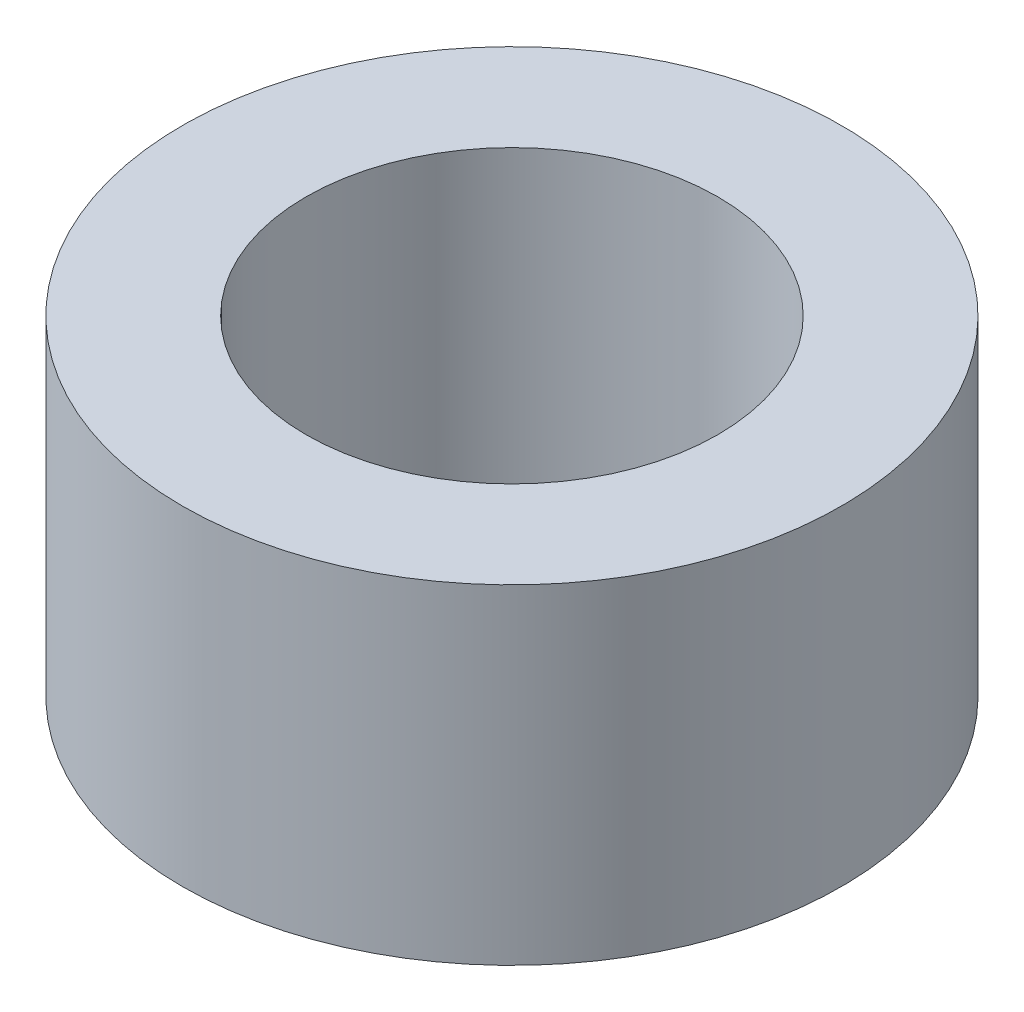
ISO-10303-21;
HEADER;
FILE_DESCRIPTION(('STEP AP214'),'2;1');
FILE_NAME('part.step','',(''),(''),'','','');
FILE_SCHEMA(('AUTOMOTIVE_DESIGN { 1 0 10303 214 1 1 1 1 }'));
ENDSEC;
DATA;
#1=APPLICATION_CONTEXT('core data for automotive mechanical design processes');
#2=APPLICATION_PROTOCOL_DEFINITION('international standard','automotive_design',2000,#1);
#3=PRODUCT_CONTEXT('',#1,'mechanical');
#4=PRODUCT('Part','Part','',(#3));
#5=PRODUCT_RELATED_PRODUCT_CATEGORY('part','',(#4));
#6=PRODUCT_DEFINITION_FORMATION('','',#4);
#7=PRODUCT_DEFINITION_CONTEXT('part definition',#1,'design');
#8=PRODUCT_DEFINITION('design','',#6,#7);
#9=PRODUCT_DEFINITION_SHAPE('','',#8);
#10=(LENGTH_UNIT() NAMED_UNIT(*) SI_UNIT(.MILLI.,.METRE.));
#11=(NAMED_UNIT(*) PLANE_ANGLE_UNIT() SI_UNIT($,.RADIAN.));
#12=(NAMED_UNIT(*) SI_UNIT($,.STERADIAN.) SOLID_ANGLE_UNIT());
#13=UNCERTAINTY_MEASURE_WITH_UNIT(LENGTH_MEASURE(1.E-05),#10,'distance_accuracy_value','');
#14=(GEOMETRIC_REPRESENTATION_CONTEXT(3) GLOBAL_UNCERTAINTY_ASSIGNED_CONTEXT((#13)) GLOBAL_UNIT_ASSIGNED_CONTEXT((#10,
#11,#12)) REPRESENTATION_CONTEXT('',''));
#15=CARTESIAN_POINT('',(0.,0.,0.));
#16=DIRECTION('',(0.,0.,1.));
#17=DIRECTION('',(1.,0.,0.));
#18=AXIS2_PLACEMENT_3D('',#15,#16,#17);
#19=CARTESIAN_POINT('',(0.,5.,0.));
#20=DIRECTION('',(0.,1.,0.));
#21=DIRECTION('',(0.,0.,1.));
#22=AXIS2_PLACEMENT_3D('',#19,#20,#21);
#23=PLANE('',#22);
#24=CARTESIAN_POINT('',(0.,5.,0.));
#25=DIRECTION('',(0.,1.,0.));
#26=DIRECTION('',(0.,0.,1.));
#27=AXIS2_PLACEMENT_3D('',#24,#25,#26);
#28=CIRCLE('',#27,5.);
#29=CARTESIAN_POINT('',(0.,5.,5.));
#30=VERTEX_POINT('',#29);
#31=EDGE_CURVE('E10',#30,#30,#28,.T.);
#32=ORIENTED_EDGE('',*,*,#31,.T.);
#33=EDGE_LOOP('',(#32));
#34=FACE_BOUND('',#33,.T.);
#35=CARTESIAN_POINT('',(0.,5.,0.));
#36=DIRECTION('',(0.,1.,0.));
#37=DIRECTION('',(0.,0.,1.));
#38=AXIS2_PLACEMENT_3D('',#35,#36,#37);
#39=CIRCLE('',#38,3.125);
#40=CARTESIAN_POINT('',(0.,5.,3.125));
#41=VERTEX_POINT('',#40);
#42=EDGE_CURVE('E56',#41,#41,#39,.T.);
#43=ORIENTED_EDGE('',*,*,#42,.F.);
#44=EDGE_LOOP('',(#43));
#45=FACE_BOUND('',#44,.T.);
#46=ADVANCED_FACE('F43',(#34,#45),#23,.T.);
#47=CARTESIAN_POINT('',(0.,0.,0.));
#48=DIRECTION('',(0.,1.,0.));
#49=DIRECTION('',(0.,0.,1.));
#50=AXIS2_PLACEMENT_3D('',#47,#48,#49);
#51=PLANE('',#50);
#52=CARTESIAN_POINT('',(0.,0.,0.));
#53=DIRECTION('',(0.,1.,0.));
#54=DIRECTION('',(0.,0.,1.));
#55=AXIS2_PLACEMENT_3D('',#52,#53,#54);
#56=CIRCLE('',#55,5.);
#57=CARTESIAN_POINT('',(0.,0.,5.));
#58=VERTEX_POINT('',#57);
#59=EDGE_CURVE('E47',#58,#58,#56,.T.);
#60=ORIENTED_EDGE('',*,*,#59,.F.);
#61=EDGE_LOOP('',(#60));
#62=FACE_BOUND('',#61,.T.);
#63=CARTESIAN_POINT('',(0.,0.,0.));
#64=DIRECTION('',(0.,1.,0.));
#65=DIRECTION('',(0.,0.,1.));
#66=AXIS2_PLACEMENT_3D('',#63,#64,#65);
#67=CIRCLE('',#66,3.125);
#68=CARTESIAN_POINT('',(0.,0.,3.125));
#69=VERTEX_POINT('',#68);
#70=EDGE_CURVE('E58',#69,#69,#67,.T.);
#71=ORIENTED_EDGE('',*,*,#70,.T.);
#72=EDGE_LOOP('',(#71));
#73=FACE_BOUND('',#72,.T.);
#74=ADVANCED_FACE('F70',(#62,#73),#51,.F.);
#75=CARTESIAN_POINT('',(0.,5.,0.));
#76=DIRECTION('',(0.,-1.,0.));
#77=DIRECTION('',(0.,0.,-1.));
#78=AXIS2_PLACEMENT_3D('',#75,#76,#77);
#79=CYLINDRICAL_SURFACE('',#78,5.);
#80=ORIENTED_EDGE('',*,*,#31,.F.);
#81=EDGE_LOOP('',(#80));
#82=FACE_BOUND('',#81,.T.);
#83=ORIENTED_EDGE('',*,*,#59,.T.);
#84=EDGE_LOOP('',(#83));
#85=FACE_BOUND('',#84,.T.);
#86=ADVANCED_FACE('F45',(#82,#85),#79,.T.);
#87=CARTESIAN_POINT('',(0.,5.,0.));
#88=DIRECTION('',(0.,-1.,0.));
#89=DIRECTION('',(0.,0.,-1.));
#90=AXIS2_PLACEMENT_3D('',#87,#88,#89);
#91=CYLINDRICAL_SURFACE('',#90,3.125);
#92=ORIENTED_EDGE('',*,*,#42,.T.);
#93=EDGE_LOOP('',(#92));
#94=FACE_BOUND('',#93,.T.);
#95=ORIENTED_EDGE('',*,*,#70,.F.);
#96=EDGE_LOOP('',(#95));
#97=FACE_BOUND('',#96,.T.);
#98=ADVANCED_FACE('F66',(#94,#97),#91,.F.);
#99=CLOSED_SHELL('',(#46,#74,#86,#98));
#100=MANIFOLD_SOLID_BREP('B2',#99);
#101=ADVANCED_BREP_SHAPE_REPRESENTATION('',(#18,#100),#14);
#102=SHAPE_DEFINITION_REPRESENTATION(#9,#101);
ENDSEC;
END-ISO-10303-21;
